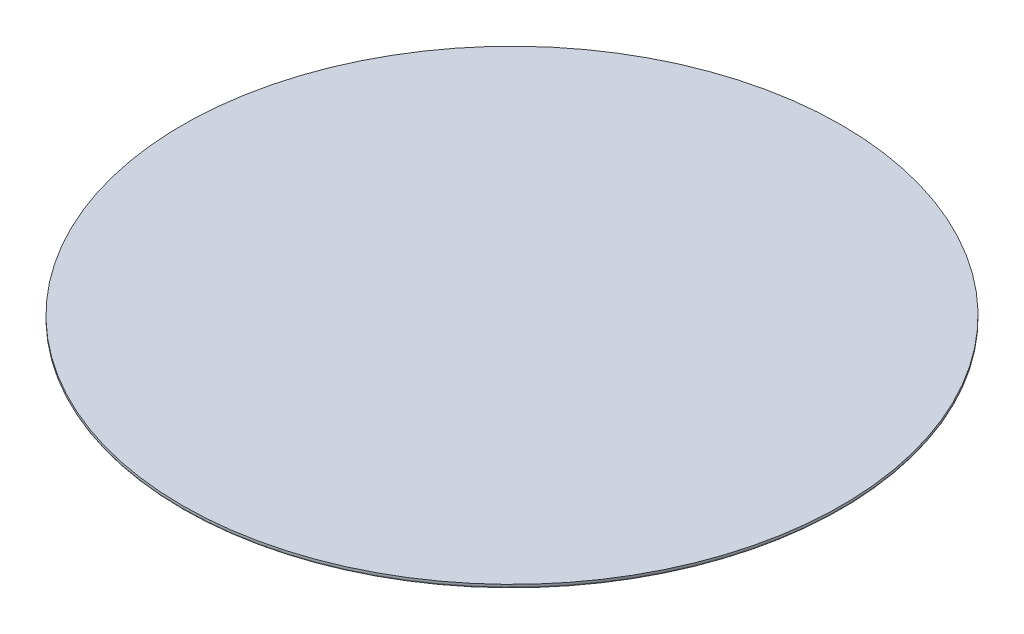
ISO-10303-21;
HEADER;
FILE_DESCRIPTION(('STEP AP214'),'2;1');
FILE_NAME('part.step','',(''),(''),'','','');
FILE_SCHEMA(('AUTOMOTIVE_DESIGN { 1 0 10303 214 1 1 1 1 }'));
ENDSEC;
DATA;
#1=APPLICATION_CONTEXT('core data for automotive mechanical design processes');
#2=APPLICATION_PROTOCOL_DEFINITION('international standard','automotive_design',2000,#1);
#3=PRODUCT_CONTEXT('',#1,'mechanical');
#4=PRODUCT('Part','Part','',(#3));
#5=PRODUCT_RELATED_PRODUCT_CATEGORY('part','',(#4));
#6=PRODUCT_DEFINITION_FORMATION('','',#4);
#7=PRODUCT_DEFINITION_CONTEXT('part definition',#1,'design');
#8=PRODUCT_DEFINITION('design','',#6,#7);
#9=PRODUCT_DEFINITION_SHAPE('','',#8);
#10=(LENGTH_UNIT() NAMED_UNIT(*) SI_UNIT(.MILLI.,.METRE.));
#11=(NAMED_UNIT(*) PLANE_ANGLE_UNIT() SI_UNIT($,.RADIAN.));
#12=(NAMED_UNIT(*) SI_UNIT($,.STERADIAN.) SOLID_ANGLE_UNIT());
#13=UNCERTAINTY_MEASURE_WITH_UNIT(LENGTH_MEASURE(1.E-05),#10,'distance_accuracy_value','');
#14=(GEOMETRIC_REPRESENTATION_CONTEXT(3) GLOBAL_UNCERTAINTY_ASSIGNED_CONTEXT((#13)) GLOBAL_UNIT_ASSIGNED_CONTEXT((#10,
#11,#12)) REPRESENTATION_CONTEXT('',''));
#15=CARTESIAN_POINT('',(0.,0.,0.));
#16=DIRECTION('',(0.,0.,1.));
#17=DIRECTION('',(1.,0.,0.));
#18=AXIS2_PLACEMENT_3D('',#15,#16,#17);
#19=CARTESIAN_POINT('',(0.,0.5,0.));
#20=DIRECTION('',(0.,-1.,0.));
#21=DIRECTION('',(0.,0.,-1.));
#22=AXIS2_PLACEMENT_3D('',#19,#20,#21);
#23=CYLINDRICAL_SURFACE('',#22,45.);
#24=CARTESIAN_POINT('',(0.,0.2,0.));
#25=DIRECTION('',(0.,1.,0.));
#26=DIRECTION('',(0.,0.,1.));
#27=AXIS2_PLACEMENT_3D('',#24,#25,#26);
#28=CIRCLE('',#27,45.);
#29=CARTESIAN_POINT('',(0.,0.2,45.));
#30=VERTEX_POINT('',#29);
#31=EDGE_CURVE('E42',#30,#30,#28,.T.);
#32=ORIENTED_EDGE('',*,*,#31,.T.);
#33=EDGE_LOOP('',(#32));
#34=FACE_BOUND('',#33,.T.);
#35=CARTESIAN_POINT('',(0.,0.5,0.));
#36=DIRECTION('',(0.,1.,0.));
#37=DIRECTION('',(0.,0.,1.));
#38=AXIS2_PLACEMENT_3D('',#35,#36,#37);
#39=CIRCLE('',#38,45.);
#40=CARTESIAN_POINT('',(0.,0.5,45.));
#41=VERTEX_POINT('',#40);
#42=EDGE_CURVE('E46',#41,#41,#39,.T.);
#43=ORIENTED_EDGE('',*,*,#42,.F.);
#44=EDGE_LOOP('',(#43));
#45=FACE_BOUND('',#44,.T.);
#46=ADVANCED_FACE('F35',(#34,#45),#23,.T.);
#47=CARTESIAN_POINT('',(0.,0.5,0.));
#48=DIRECTION('',(0.,1.,0.));
#49=DIRECTION('',(0.,0.,1.));
#50=AXIS2_PLACEMENT_3D('',#47,#48,#49);
#51=PLANE('',#50);
#52=ORIENTED_EDGE('',*,*,#42,.T.);
#53=EDGE_LOOP('',(#52));
#54=FACE_BOUND('',#53,.T.);
#55=ADVANCED_FACE('F53',(#54),#51,.T.);
#56=CARTESIAN_POINT('',(0.,95.352,0.));
#57=DIRECTION('',(0.,0.,1.));
#58=DIRECTION('',(1.,0.,0.));
#59=AXIS2_PLACEMENT_3D('',#56,#57,#58);
#60=SPHERICAL_SURFACE('',#59,105.352);
#61=CARTESIAN_POINT('',(0.,95.352,0.));
#62=DIRECTION('',(0.,1.,0.));
#63=DIRECTION('',(0.,0.,1.));
#64=AXIS2_PLACEMENT_3D('',#61,#62,#63);
#65=SPHERICAL_SURFACE('',#64,105.352);
#66=CARTESIAN_POINT('',(0.,0.,0.));
#67=DIRECTION('',(0.,1.,0.));
#68=DIRECTION('',(0.,0.,1.));
#69=AXIS2_PLACEMENT_3D('',#66,#67,#68);
#70=CIRCLE('',#69,44.8);
#71=CARTESIAN_POINT('',(0.,0.,44.8));
#72=VERTEX_POINT('',#71);
#73=EDGE_CURVE('E10',#72,#72,#70,.F.);
#74=ORIENTED_EDGE('',*,*,#73,.T.);
#75=EDGE_LOOP('',(#74));
#76=FACE_BOUND('',#75,.T.);
#77=ADVANCED_FACE('F37',(#76),#65,.T.);
#78=CARTESIAN_POINT('',(0.,0.2,0.));
#79=DIRECTION('',(0.,1.,0.));
#80=DIRECTION('',(0.,0.,1.));
#81=AXIS2_PLACEMENT_3D('',#78,#79,#80);
#82=TOROIDAL_SURFACE('',#81,44.8,0.2);
#83=ORIENTED_EDGE('',*,*,#73,.F.);
#84=EDGE_LOOP('',(#83));
#85=FACE_BOUND('',#84,.T.);
#86=ORIENTED_EDGE('',*,*,#31,.F.);
#87=EDGE_LOOP('',(#86));
#88=FACE_BOUND('',#87,.T.);
#89=ADVANCED_FACE('F61',(#85,#88),#82,.T.);
#90=CLOSED_SHELL('',(#46,#55,#77,#89));
#91=MANIFOLD_SOLID_BREP('B2',#90);
#92=ADVANCED_BREP_SHAPE_REPRESENTATION('',(#18,#91),#14);
#93=SHAPE_DEFINITION_REPRESENTATION(#9,#92);
ENDSEC;
END-ISO-10303-21;
